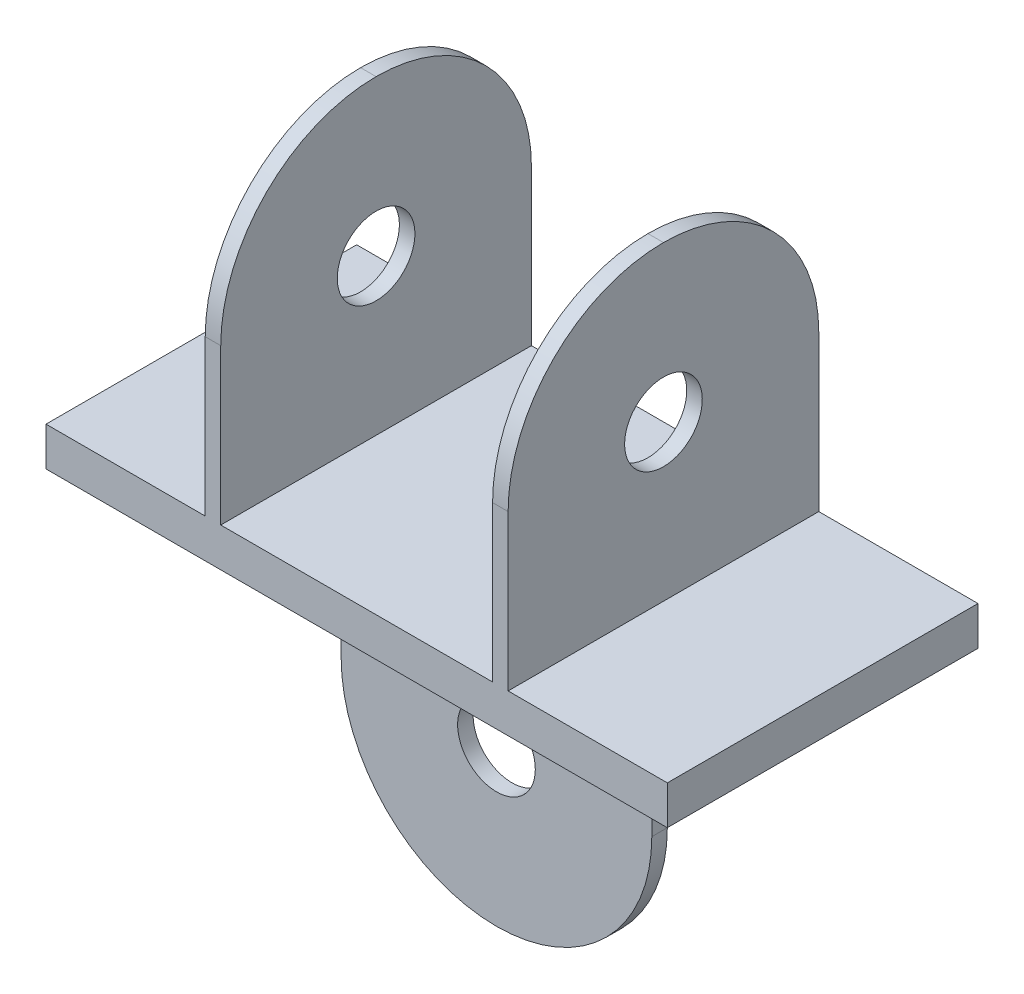
ISO-10303-21;
HEADER;
FILE_DESCRIPTION(('STEP AP214'),'2;1');
FILE_NAME('part.step','',(''),(''),'','','');
FILE_SCHEMA(('AUTOMOTIVE_DESIGN { 1 0 10303 214 1 1 1 1 }'));
ENDSEC;
DATA;
#1=APPLICATION_CONTEXT('core data for automotive mechanical design processes');
#2=APPLICATION_PROTOCOL_DEFINITION('international standard','automotive_design',2000,#1);
#3=PRODUCT_CONTEXT('',#1,'mechanical');
#4=PRODUCT('Part','Part','',(#3));
#5=PRODUCT_RELATED_PRODUCT_CATEGORY('part','',(#4));
#6=PRODUCT_DEFINITION_FORMATION('','',#4);
#7=PRODUCT_DEFINITION_CONTEXT('part definition',#1,'design');
#8=PRODUCT_DEFINITION('design','',#6,#7);
#9=PRODUCT_DEFINITION_SHAPE('','',#8);
#10=(LENGTH_UNIT() NAMED_UNIT(*) SI_UNIT(.MILLI.,.METRE.));
#11=(NAMED_UNIT(*) PLANE_ANGLE_UNIT() SI_UNIT($,.RADIAN.));
#12=(NAMED_UNIT(*) SI_UNIT($,.STERADIAN.) SOLID_ANGLE_UNIT());
#13=UNCERTAINTY_MEASURE_WITH_UNIT(LENGTH_MEASURE(1.E-05),#10,'distance_accuracy_value','');
#14=(GEOMETRIC_REPRESENTATION_CONTEXT(3) GLOBAL_UNCERTAINTY_ASSIGNED_CONTEXT((#13)) GLOBAL_UNIT_ASSIGNED_CONTEXT((#10,
#11,#12)) REPRESENTATION_CONTEXT('',''));
#15=CARTESIAN_POINT('',(0.,0.,0.));
#16=DIRECTION('',(0.,0.,1.));
#17=DIRECTION('',(1.,0.,0.));
#18=AXIS2_PLACEMENT_3D('',#15,#16,#17);
#19=CARTESIAN_POINT('',(-40.,5.,20.));
#20=DIRECTION('',(0.,-1.,0.));
#21=DIRECTION('',(1.,0.,0.));
#22=AXIS2_PLACEMENT_3D('',#19,#20,#21);
#23=PLANE('',#22);
#24=DIRECTION('',(0.,0.,1.));
#25=VECTOR('',#24,1.);
#26=CARTESIAN_POINT('',(17.5,5.00000000000001,20.));
#27=LINE('',#26,#25);
#28=CARTESIAN_POINT('',(17.5,5.00000000000001,-20.));
#29=VERTEX_POINT('',#28);
#30=CARTESIAN_POINT('',(17.5,5.00000000000001,20.));
#31=VERTEX_POINT('',#30);
#32=EDGE_CURVE('E162',#29,#31,#27,.T.);
#33=ORIENTED_EDGE('',*,*,#32,.F.);
#34=DIRECTION('',(-1.,0.,0.));
#35=VECTOR('',#34,1.);
#36=CARTESIAN_POINT('',(-40.,5.,-20.));
#37=LINE('',#36,#35);
#38=CARTESIAN_POINT('',(-17.5,5.,-20.));
#39=VERTEX_POINT('',#38);
#40=EDGE_CURVE('E172',#29,#39,#37,.T.);
#41=ORIENTED_EDGE('',*,*,#40,.T.);
#42=DIRECTION('',(0.,0.,-1.));
#43=VECTOR('',#42,1.);
#44=CARTESIAN_POINT('',(-17.5,5.,-20.));
#45=LINE('',#44,#43);
#46=CARTESIAN_POINT('',(-17.5,5.,20.));
#47=VERTEX_POINT('',#46);
#48=EDGE_CURVE('E206',#47,#39,#45,.T.);
#49=ORIENTED_EDGE('',*,*,#48,.F.);
#50=DIRECTION('',(-1.,0.,0.));
#51=VECTOR('',#50,1.);
#52=CARTESIAN_POINT('',(-40.,5.,20.));
#53=LINE('',#52,#51);
#54=EDGE_CURVE('E186',#31,#47,#53,.T.);
#55=ORIENTED_EDGE('',*,*,#54,.F.);
#56=EDGE_LOOP('',(#33,#41,#49,#55));
#57=FACE_BOUND('',#56,.T.);
#58=ADVANCED_FACE('F33',(#57),#23,.F.);
#59=DIRECTION('',(0.,0.,-1.));
#60=VECTOR('',#59,1.);
#61=CARTESIAN_POINT('',(19.5,5.00000000000001,20.));
#62=LINE('',#61,#60);
#63=CARTESIAN_POINT('',(19.5,5.00000000000001,20.));
#64=VERTEX_POINT('',#63);
#65=CARTESIAN_POINT('',(19.5,5.00000000000001,-20.));
#66=VERTEX_POINT('',#65);
#67=EDGE_CURVE('E169',#64,#66,#62,.T.);
#68=ORIENTED_EDGE('',*,*,#67,.F.);
#69=CARTESIAN_POINT('',(40.,5.00000000000002,20.));
#70=VERTEX_POINT('',#69);
#71=EDGE_CURVE('E224',#70,#64,#53,.T.);
#72=ORIENTED_EDGE('',*,*,#71,.F.);
#73=DIRECTION('',(0.,0.,-1.));
#74=VECTOR('',#73,1.);
#75=CARTESIAN_POINT('',(40.,5.00000000000002,20.));
#76=LINE('',#75,#74);
#77=CARTESIAN_POINT('',(40.,5.00000000000002,-20.));
#78=VERTEX_POINT('',#77);
#79=EDGE_CURVE('E237',#70,#78,#76,.T.);
#80=ORIENTED_EDGE('',*,*,#79,.T.);
#81=EDGE_CURVE('E181',#78,#66,#37,.T.);
#82=ORIENTED_EDGE('',*,*,#81,.T.);
#83=EDGE_LOOP('',(#68,#72,#80,#82));
#84=FACE_BOUND('',#83,.T.);
#85=ADVANCED_FACE('F350',(#84),#23,.F.);
#86=DIRECTION('',(0.,0.,1.));
#87=VECTOR('',#86,1.);
#88=CARTESIAN_POINT('',(-19.5,5.,-20.));
#89=LINE('',#88,#87);
#90=CARTESIAN_POINT('',(-19.5,5.,-20.));
#91=VERTEX_POINT('',#90);
#92=CARTESIAN_POINT('',(-19.5,5.,20.));
#93=VERTEX_POINT('',#92);
#94=EDGE_CURVE('E203',#91,#93,#89,.T.);
#95=ORIENTED_EDGE('',*,*,#94,.F.);
#96=CARTESIAN_POINT('',(-40.,5.,-20.));
#97=VERTEX_POINT('',#96);
#98=EDGE_CURVE('E182',#91,#97,#37,.T.);
#99=ORIENTED_EDGE('',*,*,#98,.T.);
#100=DIRECTION('',(0.,0.,-1.));
#101=VECTOR('',#100,1.);
#102=CARTESIAN_POINT('',(-40.,5.,20.));
#103=LINE('',#102,#101);
#104=CARTESIAN_POINT('',(-40.,5.,20.));
#105=VERTEX_POINT('',#104);
#106=EDGE_CURVE('E227',#105,#97,#103,.T.);
#107=ORIENTED_EDGE('',*,*,#106,.F.);
#108=EDGE_CURVE('E223',#93,#105,#53,.T.);
#109=ORIENTED_EDGE('',*,*,#108,.F.);
#110=EDGE_LOOP('',(#95,#99,#107,#109));
#111=FACE_BOUND('',#110,.T.);
#112=ADVANCED_FACE('F352',(#111),#23,.F.);
#113=CARTESIAN_POINT('',(-20.,0.,2.));
#114=DIRECTION('',(1.,0.,0.));
#115=DIRECTION('',(0.,1.,0.));
#116=AXIS2_PLACEMENT_3D('',#113,#114,#115);
#117=PLANE('',#116);
#118=DIRECTION('',(0.,-1.,0.));
#119=VECTOR('',#118,1.);
#120=CARTESIAN_POINT('',(-20.,0.,0.));
#121=LINE('',#120,#119);
#122=CARTESIAN_POINT('',(-20.,0.,0.));
#123=VERTEX_POINT('',#122);
#124=CARTESIAN_POINT('',(-20.,-20.,0.));
#125=VERTEX_POINT('',#124);
#126=EDGE_CURVE('E246',#123,#125,#121,.T.);
#127=ORIENTED_EDGE('',*,*,#126,.T.);
#128=DIRECTION('',(0.,0.,-1.));
#129=VECTOR('',#128,1.);
#130=CARTESIAN_POINT('',(-20.,-20.,2.));
#131=LINE('',#130,#129);
#132=CARTESIAN_POINT('',(-20.,-20.,2.));
#133=VERTEX_POINT('',#132);
#134=EDGE_CURVE('E274',#133,#125,#131,.T.);
#135=ORIENTED_EDGE('',*,*,#134,.F.);
#136=DIRECTION('',(0.,-1.,0.));
#137=VECTOR('',#136,1.);
#138=CARTESIAN_POINT('',(-20.,0.,2.));
#139=LINE('',#138,#137);
#140=CARTESIAN_POINT('',(-20.,0.,2.));
#141=VERTEX_POINT('',#140);
#142=EDGE_CURVE('E247',#141,#133,#139,.T.);
#143=ORIENTED_EDGE('',*,*,#142,.F.);
#144=DIRECTION('',(0.,0.,-1.));
#145=VECTOR('',#144,1.);
#146=CARTESIAN_POINT('',(-20.,0.,2.));
#147=LINE('',#146,#145);
#148=EDGE_CURVE('E257',#141,#123,#147,.T.);
#149=ORIENTED_EDGE('',*,*,#148,.T.);
#150=EDGE_LOOP('',(#127,#135,#143,#149));
#151=FACE_BOUND('',#150,.T.);
#152=ADVANCED_FACE('F328',(#151),#117,.F.);
#153=CARTESIAN_POINT('',(0.,-20.,2.));
#154=DIRECTION('',(0.,0.,-1.));
#155=DIRECTION('',(-1.,0.,0.));
#156=AXIS2_PLACEMENT_3D('',#153,#154,#155);
#157=CYLINDRICAL_SURFACE('',#156,20.);
#158=CARTESIAN_POINT('',(0.,-20.,0.));
#159=DIRECTION('',(0.,0.,1.));
#160=DIRECTION('',(1.,0.,0.));
#161=AXIS2_PLACEMENT_3D('',#158,#159,#160);
#162=CIRCLE('',#161,20.);
#163=CARTESIAN_POINT('',(20.,-20.,0.));
#164=VERTEX_POINT('',#163);
#165=EDGE_CURVE('E260',#125,#164,#162,.T.);
#166=ORIENTED_EDGE('',*,*,#165,.T.);
#167=DIRECTION('',(0.,0.,-1.));
#168=VECTOR('',#167,1.);
#169=CARTESIAN_POINT('',(20.,-20.,2.));
#170=LINE('',#169,#168);
#171=CARTESIAN_POINT('',(20.,-20.,2.));
#172=VERTEX_POINT('',#171);
#173=EDGE_CURVE('E271',#172,#164,#170,.T.);
#174=ORIENTED_EDGE('',*,*,#173,.F.);
#175=CARTESIAN_POINT('',(0.,-20.,2.));
#176=DIRECTION('',(0.,0.,1.));
#177=DIRECTION('',(1.,0.,0.));
#178=AXIS2_PLACEMENT_3D('',#175,#176,#177);
#179=CIRCLE('',#178,20.);
#180=EDGE_CURVE('E250',#133,#172,#179,.T.);
#181=ORIENTED_EDGE('',*,*,#180,.F.);
#182=ORIENTED_EDGE('',*,*,#134,.T.);
#183=EDGE_LOOP('',(#166,#174,#181,#182));
#184=FACE_BOUND('',#183,.T.);
#185=ADVANCED_FACE('F331',(#184),#157,.T.);
#186=CARTESIAN_POINT('',(20.,0.,2.));
#187=DIRECTION('',(-1.,0.,0.));
#188=DIRECTION('',(0.,-1.,0.));
#189=AXIS2_PLACEMENT_3D('',#186,#187,#188);
#190=PLANE('',#189);
#191=DIRECTION('',(0.,1.,0.));
#192=VECTOR('',#191,1.);
#193=CARTESIAN_POINT('',(20.,0.,0.));
#194=LINE('',#193,#192);
#195=CARTESIAN_POINT('',(20.,0.,0.));
#196=VERTEX_POINT('',#195);
#197=EDGE_CURVE('E262',#164,#196,#194,.T.);
#198=ORIENTED_EDGE('',*,*,#197,.T.);
#199=DIRECTION('',(0.,0.,-1.));
#200=VECTOR('',#199,1.);
#201=CARTESIAN_POINT('',(20.,0.,2.));
#202=LINE('',#201,#200);
#203=CARTESIAN_POINT('',(20.,0.,2.));
#204=VERTEX_POINT('',#203);
#205=EDGE_CURVE('E268',#204,#196,#202,.T.);
#206=ORIENTED_EDGE('',*,*,#205,.F.);
#207=DIRECTION('',(0.,1.,0.));
#208=VECTOR('',#207,1.);
#209=CARTESIAN_POINT('',(20.,0.,2.));
#210=LINE('',#209,#208);
#211=EDGE_CURVE('E253',#172,#204,#210,.T.);
#212=ORIENTED_EDGE('',*,*,#211,.F.);
#213=ORIENTED_EDGE('',*,*,#173,.T.);
#214=EDGE_LOOP('',(#198,#206,#212,#213));
#215=FACE_BOUND('',#214,.T.);
#216=ADVANCED_FACE('F320',(#215),#190,.F.);
#217=CARTESIAN_POINT('',(0.,-20.,2.));
#218=DIRECTION('',(0.,0.,1.));
#219=DIRECTION('',(1.,0.,0.));
#220=AXIS2_PLACEMENT_3D('',#217,#218,#219);
#221=PLANE('',#220);
#222=CARTESIAN_POINT('',(0.,-20.,2.));
#223=DIRECTION('',(0.,0.,1.));
#224=DIRECTION('',(1.,0.,0.));
#225=AXIS2_PLACEMENT_3D('',#222,#223,#224);
#226=CIRCLE('',#225,5.);
#227=CARTESIAN_POINT('',(5.00000000000001,-20.,2.));
#228=VERTEX_POINT('',#227);
#229=EDGE_CURVE('E308',#228,#228,#226,.T.);
#230=ORIENTED_EDGE('',*,*,#229,.F.);
#231=EDGE_LOOP('',(#230));
#232=FACE_BOUND('',#231,.T.);
#233=ORIENTED_EDGE('',*,*,#142,.T.);
#234=ORIENTED_EDGE('',*,*,#180,.T.);
#235=ORIENTED_EDGE('',*,*,#211,.T.);
#236=DIRECTION('',(-1.,0.,0.));
#237=VECTOR('',#236,1.);
#238=CARTESIAN_POINT('',(-20.,0.,2.));
#239=LINE('',#238,#237);
#240=EDGE_CURVE('E255',#204,#141,#239,.T.);
#241=ORIENTED_EDGE('',*,*,#240,.T.);
#242=EDGE_LOOP('',(#233,#234,#235,#241));
#243=FACE_BOUND('',#242,.T.);
#244=ADVANCED_FACE('F316',(#232,#243),#221,.T.);
#245=CARTESIAN_POINT('',(0.,-20.,0.));
#246=DIRECTION('',(0.,0.,1.));
#247=DIRECTION('',(1.,0.,0.));
#248=AXIS2_PLACEMENT_3D('',#245,#246,#247);
#249=PLANE('',#248);
#250=CARTESIAN_POINT('',(0.,-20.,0.));
#251=DIRECTION('',(0.,0.,1.));
#252=DIRECTION('',(1.,0.,0.));
#253=AXIS2_PLACEMENT_3D('',#250,#251,#252);
#254=CIRCLE('',#253,5.);
#255=CARTESIAN_POINT('',(5.00000000000001,-20.,0.));
#256=VERTEX_POINT('',#255);
#257=EDGE_CURVE('E37',#256,#256,#254,.T.);
#258=ORIENTED_EDGE('',*,*,#257,.T.);
#259=EDGE_LOOP('',(#258));
#260=FACE_BOUND('',#259,.T.);
#261=ORIENTED_EDGE('',*,*,#126,.F.);
#262=DIRECTION('',(-1.,0.,0.));
#263=VECTOR('',#262,1.);
#264=CARTESIAN_POINT('',(-20.,0.,0.));
#265=LINE('',#264,#263);
#266=EDGE_CURVE('E251',#196,#123,#265,.T.);
#267=ORIENTED_EDGE('',*,*,#266,.F.);
#268=ORIENTED_EDGE('',*,*,#197,.F.);
#269=ORIENTED_EDGE('',*,*,#165,.F.);
#270=EDGE_LOOP('',(#261,#267,#268,#269));
#271=FACE_BOUND('',#270,.T.);
#272=ADVANCED_FACE('F319',(#260,#271),#249,.F.);
#273=CARTESIAN_POINT('',(-40.,0.,20.));
#274=DIRECTION('',(0.,1.,0.));
#275=DIRECTION('',(-1.,0.,0.));
#276=AXIS2_PLACEMENT_3D('',#273,#274,#275);
#277=PLANE('',#276);
#278=DIRECTION('',(1.,0.,0.));
#279=VECTOR('',#278,1.);
#280=CARTESIAN_POINT('',(-40.,0.,-20.));
#281=LINE('',#280,#279);
#282=CARTESIAN_POINT('',(-40.,0.,-20.));
#283=VERTEX_POINT('',#282);
#284=CARTESIAN_POINT('',(40.,0.,-20.));
#285=VERTEX_POINT('',#284);
#286=EDGE_CURVE('E230',#283,#285,#281,.T.);
#287=ORIENTED_EDGE('',*,*,#286,.T.);
#288=DIRECTION('',(0.,0.,-1.));
#289=VECTOR('',#288,1.);
#290=CARTESIAN_POINT('',(40.,0.,20.));
#291=LINE('',#290,#289);
#292=CARTESIAN_POINT('',(40.,0.,20.));
#293=VERTEX_POINT('',#292);
#294=EDGE_CURVE('E240',#293,#285,#291,.T.);
#295=ORIENTED_EDGE('',*,*,#294,.F.);
#296=DIRECTION('',(1.,0.,0.));
#297=VECTOR('',#296,1.);
#298=CARTESIAN_POINT('',(-40.,0.,20.));
#299=LINE('',#298,#297);
#300=CARTESIAN_POINT('',(-40.,0.,20.));
#301=VERTEX_POINT('',#300);
#302=EDGE_CURVE('E219',#301,#293,#299,.T.);
#303=ORIENTED_EDGE('',*,*,#302,.F.);
#304=DIRECTION('',(0.,0.,-1.));
#305=VECTOR('',#304,1.);
#306=CARTESIAN_POINT('',(-40.,0.,20.));
#307=LINE('',#306,#305);
#308=EDGE_CURVE('E243',#301,#283,#307,.T.);
#309=ORIENTED_EDGE('',*,*,#308,.T.);
#310=EDGE_LOOP('',(#287,#295,#303,#309));
#311=FACE_BOUND('',#310,.T.);
#312=ORIENTED_EDGE('',*,*,#205,.T.);
#313=ORIENTED_EDGE('',*,*,#266,.T.);
#314=ORIENTED_EDGE('',*,*,#148,.F.);
#315=ORIENTED_EDGE('',*,*,#240,.F.);
#316=EDGE_LOOP('',(#312,#313,#314,#315));
#317=FACE_BOUND('',#316,.T.);
#318=ADVANCED_FACE('F337',(#311,#317),#277,.F.);
#319=CARTESIAN_POINT('',(-40.,0.,20.));
#320=DIRECTION('',(1.,0.,0.));
#321=DIRECTION('',(0.,0.,-1.));
#322=AXIS2_PLACEMENT_3D('',#319,#320,#321);
#323=PLANE('',#322);
#324=DIRECTION('',(0.,-1.,0.));
#325=VECTOR('',#324,1.);
#326=CARTESIAN_POINT('',(-40.,0.,-20.));
#327=LINE('',#326,#325);
#328=EDGE_CURVE('E215',#97,#283,#327,.T.);
#329=ORIENTED_EDGE('',*,*,#328,.T.);
#330=ORIENTED_EDGE('',*,*,#308,.F.);
#331=DIRECTION('',(0.,-1.,0.));
#332=VECTOR('',#331,1.);
#333=CARTESIAN_POINT('',(-40.,0.,20.));
#334=LINE('',#333,#332);
#335=EDGE_CURVE('E216',#105,#301,#334,.T.);
#336=ORIENTED_EDGE('',*,*,#335,.F.);
#337=ORIENTED_EDGE('',*,*,#106,.T.);
#338=EDGE_LOOP('',(#329,#330,#336,#337));
#339=FACE_BOUND('',#338,.T.);
#340=ADVANCED_FACE('F345',(#339),#323,.F.);
#341=CARTESIAN_POINT('',(40.,0.,20.));
#342=DIRECTION('',(-1.,0.,0.));
#343=DIRECTION('',(0.,0.,1.));
#344=AXIS2_PLACEMENT_3D('',#341,#342,#343);
#345=PLANE('',#344);
#346=DIRECTION('',(0.,1.,0.));
#347=VECTOR('',#346,1.);
#348=CARTESIAN_POINT('',(40.,0.,-20.));
#349=LINE('',#348,#347);
#350=EDGE_CURVE('E232',#285,#78,#349,.T.);
#351=ORIENTED_EDGE('',*,*,#350,.T.);
#352=ORIENTED_EDGE('',*,*,#79,.F.);
#353=DIRECTION('',(0.,1.,0.));
#354=VECTOR('',#353,1.);
#355=CARTESIAN_POINT('',(40.,0.,20.));
#356=LINE('',#355,#354);
#357=EDGE_CURVE('E221',#293,#70,#356,.T.);
#358=ORIENTED_EDGE('',*,*,#357,.F.);
#359=ORIENTED_EDGE('',*,*,#294,.T.);
#360=EDGE_LOOP('',(#351,#352,#358,#359));
#361=FACE_BOUND('',#360,.T.);
#362=ADVANCED_FACE('F405',(#361),#345,.F.);
#363=CARTESIAN_POINT('',(0.,0.,20.));
#364=DIRECTION('',(0.,0.,-1.));
#365=DIRECTION('',(-1.,0.,0.));
#366=AXIS2_PLACEMENT_3D('',#363,#364,#365);
#367=PLANE('',#366);
#368=DIRECTION('',(0.,-1.,0.));
#369=VECTOR('',#368,1.);
#370=CARTESIAN_POINT('',(-17.5,45.,20.));
#371=LINE('',#370,#369);
#372=CARTESIAN_POINT('',(-17.5,25.,20.));
#373=VERTEX_POINT('',#372);
#374=EDGE_CURVE('E211',#373,#47,#371,.T.);
#375=ORIENTED_EDGE('',*,*,#374,.F.);
#376=DIRECTION('',(1.,0.,0.));
#377=VECTOR('',#376,1.);
#378=CARTESIAN_POINT('',(-19.5,25.,20.));
#379=LINE('',#378,#377);
#380=CARTESIAN_POINT('',(-19.5,25.,20.));
#381=VERTEX_POINT('',#380);
#382=EDGE_CURVE('E11',#373,#381,#379,.F.);
#383=ORIENTED_EDGE('',*,*,#382,.T.);
#384=DIRECTION('',(0.,-1.,0.));
#385=VECTOR('',#384,1.);
#386=CARTESIAN_POINT('',(-19.5,45.,20.));
#387=LINE('',#386,#385);
#388=EDGE_CURVE('E213',#381,#93,#387,.T.);
#389=ORIENTED_EDGE('',*,*,#388,.T.);
#390=ORIENTED_EDGE('',*,*,#108,.T.);
#391=ORIENTED_EDGE('',*,*,#335,.T.);
#392=ORIENTED_EDGE('',*,*,#302,.T.);
#393=ORIENTED_EDGE('',*,*,#357,.T.);
#394=ORIENTED_EDGE('',*,*,#71,.T.);
#395=DIRECTION('',(0.,-1.,0.));
#396=VECTOR('',#395,1.);
#397=CARTESIAN_POINT('',(19.5,45.,20.));
#398=LINE('',#397,#396);
#399=CARTESIAN_POINT('',(19.5,25.,20.));
#400=VERTEX_POINT('',#399);
#401=EDGE_CURVE('E199',#400,#64,#398,.T.);
#402=ORIENTED_EDGE('',*,*,#401,.F.);
#403=DIRECTION('',(1.,0.,0.));
#404=VECTOR('',#403,1.);
#405=CARTESIAN_POINT('',(0.,25.,20.));
#406=LINE('',#405,#404);
#407=CARTESIAN_POINT('',(17.5,25.,20.));
#408=VERTEX_POINT('',#407);
#409=EDGE_CURVE('E42',#400,#408,#406,.F.);
#410=ORIENTED_EDGE('',*,*,#409,.T.);
#411=DIRECTION('',(0.,-1.,0.));
#412=VECTOR('',#411,1.);
#413=CARTESIAN_POINT('',(17.5,45.,20.));
#414=LINE('',#413,#412);
#415=EDGE_CURVE('E201',#408,#31,#414,.T.);
#416=ORIENTED_EDGE('',*,*,#415,.T.);
#417=ORIENTED_EDGE('',*,*,#54,.T.);
#418=EDGE_LOOP('',(#375,#383,#389,#390,#391,#392,#393,#394,#402,#410,#416,#417));
#419=FACE_BOUND('',#418,.T.);
#420=ADVANCED_FACE('F379',(#419),#367,.F.);
#421=CARTESIAN_POINT('',(0.,0.,-20.));
#422=DIRECTION('',(0.,0.,-1.));
#423=DIRECTION('',(-1.,0.,0.));
#424=AXIS2_PLACEMENT_3D('',#421,#422,#423);
#425=PLANE('',#424);
#426=DIRECTION('',(0.,-1.,0.));
#427=VECTOR('',#426,1.);
#428=CARTESIAN_POINT('',(-19.5,45.,-20.));
#429=LINE('',#428,#427);
#430=CARTESIAN_POINT('',(-19.5,25.,-20.));
#431=VERTEX_POINT('',#430);
#432=EDGE_CURVE('E208',#431,#91,#429,.T.);
#433=ORIENTED_EDGE('',*,*,#432,.F.);
#434=DIRECTION('',(-1.,0.,0.));
#435=VECTOR('',#434,1.);
#436=CARTESIAN_POINT('',(0.,25.,-20.));
#437=LINE('',#436,#435);
#438=CARTESIAN_POINT('',(-17.5,25.,-20.));
#439=VERTEX_POINT('',#438);
#440=EDGE_CURVE('E283',#431,#439,#437,.F.);
#441=ORIENTED_EDGE('',*,*,#440,.T.);
#442=DIRECTION('',(0.,-1.,0.));
#443=VECTOR('',#442,1.);
#444=CARTESIAN_POINT('',(-17.5,45.,-20.));
#445=LINE('',#444,#443);
#446=EDGE_CURVE('E177',#439,#39,#445,.T.);
#447=ORIENTED_EDGE('',*,*,#446,.T.);
#448=ORIENTED_EDGE('',*,*,#40,.F.);
#449=DIRECTION('',(0.,-1.,0.));
#450=VECTOR('',#449,1.);
#451=CARTESIAN_POINT('',(17.5,45.,-20.));
#452=LINE('',#451,#450);
#453=CARTESIAN_POINT('',(17.5,25.,-20.));
#454=VERTEX_POINT('',#453);
#455=EDGE_CURVE('E157',#454,#29,#452,.T.);
#456=ORIENTED_EDGE('',*,*,#455,.F.);
#457=DIRECTION('',(-1.,0.,0.));
#458=VECTOR('',#457,1.);
#459=CARTESIAN_POINT('',(19.5,25.,-20.));
#460=LINE('',#459,#458);
#461=CARTESIAN_POINT('',(19.5,25.,-20.));
#462=VERTEX_POINT('',#461);
#463=EDGE_CURVE('E281',#454,#462,#460,.F.);
#464=ORIENTED_EDGE('',*,*,#463,.T.);
#465=DIRECTION('',(0.,-1.,0.));
#466=VECTOR('',#465,1.);
#467=CARTESIAN_POINT('',(19.5,45.,-20.));
#468=LINE('',#467,#466);
#469=EDGE_CURVE('E168',#462,#66,#468,.T.);
#470=ORIENTED_EDGE('',*,*,#469,.T.);
#471=ORIENTED_EDGE('',*,*,#81,.F.);
#472=ORIENTED_EDGE('',*,*,#350,.F.);
#473=ORIENTED_EDGE('',*,*,#286,.F.);
#474=ORIENTED_EDGE('',*,*,#328,.F.);
#475=ORIENTED_EDGE('',*,*,#98,.F.);
#476=EDGE_LOOP('',(#433,#441,#447,#448,#456,#464,#470,#471,#472,#473,#474,#475));
#477=FACE_BOUND('',#476,.T.);
#478=ADVANCED_FACE('F174',(#477),#425,.T.);
#479=CARTESIAN_POINT('',(-19.5,45.,-20.));
#480=DIRECTION('',(1.,0.,0.));
#481=DIRECTION('',(0.,1.,0.));
#482=AXIS2_PLACEMENT_3D('',#479,#480,#481);
#483=PLANE('',#482);
#484=CARTESIAN_POINT('',(-19.5,25.,0.));
#485=DIRECTION('',(-1.,0.,0.));
#486=DIRECTION('',(0.,-1.,0.));
#487=AXIS2_PLACEMENT_3D('',#484,#485,#486);
#488=CIRCLE('',#487,5.);
#489=CARTESIAN_POINT('',(-19.5,20.,0.));
#490=VERTEX_POINT('',#489);
#491=EDGE_CURVE('E299',#490,#490,#488,.T.);
#492=ORIENTED_EDGE('',*,*,#491,.F.);
#493=EDGE_LOOP('',(#492));
#494=FACE_BOUND('',#493,.T.);
#495=CARTESIAN_POINT('',(-19.5,25.,0.));
#496=DIRECTION('',(1.,0.,0.));
#497=DIRECTION('',(0.,1.,0.));
#498=AXIS2_PLACEMENT_3D('',#495,#496,#497);
#499=CIRCLE('',#498,20.);
#500=CARTESIAN_POINT('',(-19.5,45.,0.));
#501=VERTEX_POINT('',#500);
#502=EDGE_CURVE('E277',#381,#501,#499,.F.);
#503=ORIENTED_EDGE('',*,*,#502,.T.);
#504=CARTESIAN_POINT('',(-19.5,25.,0.));
#505=DIRECTION('',(1.,0.,0.));
#506=DIRECTION('',(0.,1.,0.));
#507=AXIS2_PLACEMENT_3D('',#504,#505,#506);
#508=CIRCLE('',#507,20.);
#509=EDGE_CURVE('E279',#501,#431,#508,.F.);
#510=ORIENTED_EDGE('',*,*,#509,.T.);
#511=ORIENTED_EDGE('',*,*,#432,.T.);
#512=ORIENTED_EDGE('',*,*,#94,.T.);
#513=ORIENTED_EDGE('',*,*,#388,.F.);
#514=EDGE_LOOP('',(#503,#510,#511,#512,#513));
#515=FACE_BOUND('',#514,.T.);
#516=ADVANCED_FACE('F392',(#494,#515),#483,.F.);
#517=CARTESIAN_POINT('',(-17.5,45.,-20.));
#518=DIRECTION('',(-1.,0.,0.));
#519=DIRECTION('',(0.,0.,1.));
#520=AXIS2_PLACEMENT_3D('',#517,#518,#519);
#521=PLANE('',#520);
#522=CARTESIAN_POINT('',(-17.5,25.,0.));
#523=DIRECTION('',(-1.,0.,0.));
#524=DIRECTION('',(0.,0.,1.));
#525=AXIS2_PLACEMENT_3D('',#522,#523,#524);
#526=CIRCLE('',#525,5.);
#527=CARTESIAN_POINT('',(-17.5,25.,4.99999999999993));
#528=VERTEX_POINT('',#527);
#529=EDGE_CURVE('E195',#528,#528,#526,.T.);
#530=ORIENTED_EDGE('',*,*,#529,.T.);
#531=EDGE_LOOP('',(#530));
#532=FACE_BOUND('',#531,.T.);
#533=ORIENTED_EDGE('',*,*,#446,.F.);
#534=CARTESIAN_POINT('',(-17.5,25.,0.));
#535=DIRECTION('',(-1.,0.,0.));
#536=DIRECTION('',(0.,0.,1.));
#537=AXIS2_PLACEMENT_3D('',#534,#535,#536);
#538=CIRCLE('',#537,20.);
#539=CARTESIAN_POINT('',(-17.5,45.,0.));
#540=VERTEX_POINT('',#539);
#541=EDGE_CURVE('E287',#439,#540,#538,.F.);
#542=ORIENTED_EDGE('',*,*,#541,.T.);
#543=CARTESIAN_POINT('',(-17.5,25.,0.));
#544=DIRECTION('',(-1.,0.,0.));
#545=DIRECTION('',(0.,0.,1.));
#546=AXIS2_PLACEMENT_3D('',#543,#544,#545);
#547=CIRCLE('',#546,20.);
#548=EDGE_CURVE('E285',#540,#373,#547,.F.);
#549=ORIENTED_EDGE('',*,*,#548,.T.);
#550=ORIENTED_EDGE('',*,*,#374,.T.);
#551=ORIENTED_EDGE('',*,*,#48,.T.);
#552=EDGE_LOOP('',(#533,#542,#549,#550,#551));
#553=FACE_BOUND('',#552,.T.);
#554=ADVANCED_FACE('F383',(#532,#553),#521,.F.);
#555=CARTESIAN_POINT('',(17.5,45.,20.));
#556=DIRECTION('',(1.,0.,0.));
#557=DIRECTION('',(0.,1.,0.));
#558=AXIS2_PLACEMENT_3D('',#555,#556,#557);
#559=PLANE('',#558);
#560=CARTESIAN_POINT('',(17.5,25.,0.));
#561=DIRECTION('',(1.,0.,0.));
#562=DIRECTION('',(0.,1.,0.));
#563=AXIS2_PLACEMENT_3D('',#560,#561,#562);
#564=CIRCLE('',#563,5.);
#565=CARTESIAN_POINT('',(17.5,30.,0.));
#566=VERTEX_POINT('',#565);
#567=EDGE_CURVE('E298',#566,#566,#564,.T.);
#568=ORIENTED_EDGE('',*,*,#567,.T.);
#569=EDGE_LOOP('',(#568));
#570=FACE_BOUND('',#569,.T.);
#571=CARTESIAN_POINT('',(17.5,25.,0.));
#572=DIRECTION('',(1.,0.,0.));
#573=DIRECTION('',(0.,1.,0.));
#574=AXIS2_PLACEMENT_3D('',#571,#572,#573);
#575=CIRCLE('',#574,20.);
#576=CARTESIAN_POINT('',(17.5,45.,0.));
#577=VERTEX_POINT('',#576);
#578=EDGE_CURVE('E289',#408,#577,#575,.F.);
#579=ORIENTED_EDGE('',*,*,#578,.T.);
#580=CARTESIAN_POINT('',(17.5,25.,0.));
#581=DIRECTION('',(1.,0.,0.));
#582=DIRECTION('',(0.,1.,0.));
#583=AXIS2_PLACEMENT_3D('',#580,#581,#582);
#584=CIRCLE('',#583,20.);
#585=EDGE_CURVE('E164',#577,#454,#584,.F.);
#586=ORIENTED_EDGE('',*,*,#585,.T.);
#587=ORIENTED_EDGE('',*,*,#455,.T.);
#588=ORIENTED_EDGE('',*,*,#32,.T.);
#589=ORIENTED_EDGE('',*,*,#415,.F.);
#590=EDGE_LOOP('',(#579,#586,#587,#588,#589));
#591=FACE_BOUND('',#590,.T.);
#592=ADVANCED_FACE('F159',(#570,#591),#559,.F.);
#593=CARTESIAN_POINT('',(19.5,45.,20.));
#594=DIRECTION('',(-1.,0.,0.));
#595=DIRECTION('',(0.,-1.,0.));
#596=AXIS2_PLACEMENT_3D('',#593,#594,#595);
#597=PLANE('',#596);
#598=CARTESIAN_POINT('',(19.5,25.,0.));
#599=DIRECTION('',(-1.,0.,0.));
#600=DIRECTION('',(0.,-1.,0.));
#601=AXIS2_PLACEMENT_3D('',#598,#599,#600);
#602=CIRCLE('',#601,5.);
#603=CARTESIAN_POINT('',(19.5,20.,0.));
#604=VERTEX_POINT('',#603);
#605=EDGE_CURVE('E296',#604,#604,#602,.T.);
#606=ORIENTED_EDGE('',*,*,#605,.T.);
#607=EDGE_LOOP('',(#606));
#608=FACE_BOUND('',#607,.T.);
#609=ORIENTED_EDGE('',*,*,#469,.F.);
#610=CARTESIAN_POINT('',(19.5,25.,0.));
#611=DIRECTION('',(-1.,0.,0.));
#612=DIRECTION('',(0.,-1.,0.));
#613=AXIS2_PLACEMENT_3D('',#610,#611,#612);
#614=CIRCLE('',#613,20.);
#615=CARTESIAN_POINT('',(19.5,45.,0.));
#616=VERTEX_POINT('',#615);
#617=EDGE_CURVE('E55',#462,#616,#614,.F.);
#618=ORIENTED_EDGE('',*,*,#617,.T.);
#619=CARTESIAN_POINT('',(19.5,25.,0.));
#620=DIRECTION('',(-1.,0.,0.));
#621=DIRECTION('',(0.,-1.,0.));
#622=AXIS2_PLACEMENT_3D('',#619,#620,#621);
#623=CIRCLE('',#622,20.);
#624=EDGE_CURVE('E50',#616,#400,#623,.F.);
#625=ORIENTED_EDGE('',*,*,#624,.T.);
#626=ORIENTED_EDGE('',*,*,#401,.T.);
#627=ORIENTED_EDGE('',*,*,#67,.T.);
#628=EDGE_LOOP('',(#609,#618,#625,#626,#627));
#629=FACE_BOUND('',#628,.T.);
#630=ADVANCED_FACE('F419',(#608,#629),#597,.F.);
#631=CARTESIAN_POINT('',(0.,25.,0.));
#632=DIRECTION('',(-1.,0.,0.));
#633=DIRECTION('',(0.,0.,1.));
#634=AXIS2_PLACEMENT_3D('',#631,#632,#633);
#635=CYLINDRICAL_SURFACE('',#634,20.);
#636=ORIENTED_EDGE('',*,*,#382,.F.);
#637=ORIENTED_EDGE('',*,*,#548,.F.);
#638=DIRECTION('',(1.,0.,0.));
#639=VECTOR('',#638,1.);
#640=CARTESIAN_POINT('',(-17.5,45.,0.));
#641=LINE('',#640,#639);
#642=EDGE_CURVE('E187',#501,#540,#641,.T.);
#643=ORIENTED_EDGE('',*,*,#642,.F.);
#644=ORIENTED_EDGE('',*,*,#502,.F.);
#645=EDGE_LOOP('',(#636,#637,#643,#644));
#646=FACE_BOUND('',#645,.T.);
#647=ADVANCED_FACE('F387',(#646),#635,.T.);
#648=CARTESIAN_POINT('',(0.,25.,0.));
#649=DIRECTION('',(-1.,0.,0.));
#650=DIRECTION('',(0.,0.,1.));
#651=AXIS2_PLACEMENT_3D('',#648,#649,#650);
#652=CYLINDRICAL_SURFACE('',#651,20.);
#653=ORIENTED_EDGE('',*,*,#541,.F.);
#654=ORIENTED_EDGE('',*,*,#440,.F.);
#655=ORIENTED_EDGE('',*,*,#509,.F.);
#656=ORIENTED_EDGE('',*,*,#642,.T.);
#657=EDGE_LOOP('',(#653,#654,#655,#656));
#658=FACE_BOUND('',#657,.T.);
#659=ADVANCED_FACE('F391',(#658),#652,.T.);
#660=CARTESIAN_POINT('',(0.,25.,0.));
#661=DIRECTION('',(1.,0.,0.));
#662=DIRECTION('',(0.,0.,-1.));
#663=AXIS2_PLACEMENT_3D('',#660,#661,#662);
#664=CYLINDRICAL_SURFACE('',#663,20.);
#665=ORIENTED_EDGE('',*,*,#409,.F.);
#666=ORIENTED_EDGE('',*,*,#624,.F.);
#667=DIRECTION('',(1.,0.,0.));
#668=VECTOR('',#667,1.);
#669=CARTESIAN_POINT('',(0.,45.,0.));
#670=LINE('',#669,#668);
#671=EDGE_CURVE('E192',#577,#616,#670,.T.);
#672=ORIENTED_EDGE('',*,*,#671,.F.);
#673=ORIENTED_EDGE('',*,*,#578,.F.);
#674=EDGE_LOOP('',(#665,#666,#672,#673));
#675=FACE_BOUND('',#674,.T.);
#676=ADVANCED_FACE('F35',(#675),#664,.T.);
#677=CARTESIAN_POINT('',(0.,25.,0.));
#678=DIRECTION('',(1.,0.,0.));
#679=DIRECTION('',(0.,0.,-1.));
#680=AXIS2_PLACEMENT_3D('',#677,#678,#679);
#681=CYLINDRICAL_SURFACE('',#680,20.);
#682=ORIENTED_EDGE('',*,*,#617,.F.);
#683=ORIENTED_EDGE('',*,*,#463,.F.);
#684=ORIENTED_EDGE('',*,*,#585,.F.);
#685=ORIENTED_EDGE('',*,*,#671,.T.);
#686=EDGE_LOOP('',(#682,#683,#684,#685));
#687=FACE_BOUND('',#686,.T.);
#688=ADVANCED_FACE('F425',(#687),#681,.T.);
#689=CARTESIAN_POINT('',(60.5,25.,0.));
#690=DIRECTION('',(-1.,0.,0.));
#691=DIRECTION('',(0.,-1.,0.));
#692=AXIS2_PLACEMENT_3D('',#689,#690,#691);
#693=CYLINDRICAL_SURFACE('',#692,5.);
#694=ORIENTED_EDGE('',*,*,#605,.F.);
#695=EDGE_LOOP('',(#694));
#696=FACE_BOUND('',#695,.T.);
#697=ORIENTED_EDGE('',*,*,#567,.F.);
#698=EDGE_LOOP('',(#697));
#699=FACE_BOUND('',#698,.T.);
#700=ADVANCED_FACE('F427',(#696,#699),#693,.F.);
#701=ORIENTED_EDGE('',*,*,#491,.T.);
#702=EDGE_LOOP('',(#701));
#703=FACE_BOUND('',#702,.T.);
#704=ORIENTED_EDGE('',*,*,#529,.F.);
#705=EDGE_LOOP('',(#704));
#706=FACE_BOUND('',#705,.T.);
#707=ADVANCED_FACE('F432',(#703,#706),#693,.F.);
#708=CARTESIAN_POINT('',(0.,-20.,-78.));
#709=DIRECTION('',(0.,0.,1.));
#710=DIRECTION('',(1.,0.,0.));
#711=AXIS2_PLACEMENT_3D('',#708,#709,#710);
#712=CYLINDRICAL_SURFACE('',#711,5.);
#713=ORIENTED_EDGE('',*,*,#229,.T.);
#714=EDGE_LOOP('',(#713));
#715=FACE_BOUND('',#714,.T.);
#716=ORIENTED_EDGE('',*,*,#257,.F.);
#717=EDGE_LOOP('',(#716));
#718=FACE_BOUND('',#717,.T.);
#719=ADVANCED_FACE('F313',(#715,#718),#712,.F.);
#720=CLOSED_SHELL('',(#58,#85,#112,#152,#185,#216,#244,#272,#318,#340,#362,#420,#478,#516,#554,
#592,#630,#647,#659,#676,#688,#700,#707,#719));
#721=MANIFOLD_SOLID_BREP('B2',#720);
#722=ADVANCED_BREP_SHAPE_REPRESENTATION('',(#18,#721),#14);
#723=SHAPE_DEFINITION_REPRESENTATION(#9,#722);
ENDSEC;
END-ISO-10303-21;
